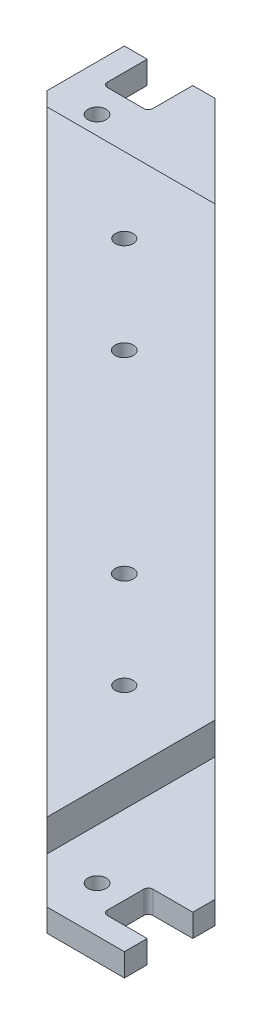
ISO-10303-21;
HEADER;
FILE_DESCRIPTION(('STEP AP214'),'2;1');
FILE_NAME('part.step','',(''),(''),'','','');
FILE_SCHEMA(('AUTOMOTIVE_DESIGN { 1 0 10303 214 1 1 1 1 }'));
ENDSEC;
DATA;
#1=APPLICATION_CONTEXT('core data for automotive mechanical design processes');
#2=APPLICATION_PROTOCOL_DEFINITION('international standard','automotive_design',2000,#1);
#3=PRODUCT_CONTEXT('',#1,'mechanical');
#4=PRODUCT('Part','Part','',(#3));
#5=PRODUCT_RELATED_PRODUCT_CATEGORY('part','',(#4));
#6=PRODUCT_DEFINITION_FORMATION('','',#4);
#7=PRODUCT_DEFINITION_CONTEXT('part definition',#1,'design');
#8=PRODUCT_DEFINITION('design','',#6,#7);
#9=PRODUCT_DEFINITION_SHAPE('','',#8);
#10=(LENGTH_UNIT() NAMED_UNIT(*) SI_UNIT(.MILLI.,.METRE.));
#11=(NAMED_UNIT(*) PLANE_ANGLE_UNIT() SI_UNIT($,.RADIAN.));
#12=(NAMED_UNIT(*) SI_UNIT($,.STERADIAN.) SOLID_ANGLE_UNIT());
#13=UNCERTAINTY_MEASURE_WITH_UNIT(LENGTH_MEASURE(1.E-05),#10,'distance_accuracy_value','');
#14=(GEOMETRIC_REPRESENTATION_CONTEXT(3) GLOBAL_UNCERTAINTY_ASSIGNED_CONTEXT((#13)) GLOBAL_UNIT_ASSIGNED_CONTEXT((#10,
#11,#12)) REPRESENTATION_CONTEXT('',''));
#15=CARTESIAN_POINT('',(0.,0.,0.));
#16=DIRECTION('',(0.,0.,1.));
#17=DIRECTION('',(1.,0.,0.));
#18=AXIS2_PLACEMENT_3D('',#15,#16,#17);
#19=CARTESIAN_POINT('',(19.8964466094067,-311.11709450595,0.25));
#20=DIRECTION('',(0.,0.,-1.));
#21=DIRECTION('',(-1.,0.,0.));
#22=AXIS2_PLACEMENT_3D('',#19,#20,#21);
#23=PLANE('',#22);
#24=DIRECTION('',(0.,1.,0.));
#25=VECTOR('',#24,1.);
#26=CARTESIAN_POINT('',(5.,0.,0.25));
#27=LINE('',#26,#25);
#28=CARTESIAN_POINT('',(5.,0.,0.25));
#29=VERTEX_POINT('',#28);
#30=CARTESIAN_POINT('',(5.,5.,0.25));
#31=VERTEX_POINT('',#30);
#32=EDGE_CURVE('E201',#29,#31,#27,.T.);
#33=ORIENTED_EDGE('',*,*,#32,.F.);
#34=DIRECTION('',(-1.,0.,0.));
#35=VECTOR('',#34,1.);
#36=CARTESIAN_POINT('',(0.,0.,0.25));
#37=LINE('',#36,#35);
#38=CARTESIAN_POINT('',(0.,0.,0.25));
#39=VERTEX_POINT('',#38);
#40=EDGE_CURVE('E208',#29,#39,#37,.T.);
#41=ORIENTED_EDGE('',*,*,#40,.T.);
#42=DIRECTION('',(0.,1.,0.));
#43=VECTOR('',#42,1.);
#44=CARTESIAN_POINT('',(0.,-311.11709450595,0.25));
#45=LINE('',#44,#43);
#46=CARTESIAN_POINT('',(0.,5.,0.25));
#47=VERTEX_POINT('',#46);
#48=EDGE_CURVE('E470',#39,#47,#45,.T.);
#49=ORIENTED_EDGE('',*,*,#48,.T.);
#50=DIRECTION('',(-1.,0.,0.));
#51=VECTOR('',#50,1.);
#52=CARTESIAN_POINT('',(0.,5.,0.25));
#53=LINE('',#52,#51);
#54=EDGE_CURVE('E297',#31,#47,#53,.T.);
#55=ORIENTED_EDGE('',*,*,#54,.F.);
#56=EDGE_LOOP('',(#33,#41,#49,#55));
#57=FACE_BOUND('',#56,.T.);
#58=ADVANCED_FACE('F37',(#57),#23,.T.);
#59=CARTESIAN_POINT('',(172.,-311.11709450595,172.249999999999));
#60=DIRECTION('',(1.,0.,0.));
#61=DIRECTION('',(0.,0.,-1.));
#62=AXIS2_PLACEMENT_3D('',#59,#60,#61);
#63=PLANE('',#62);
#64=DIRECTION('',(0.,1.,0.));
#65=VECTOR('',#64,1.);
#66=CARTESIAN_POINT('',(172.,0.,167.249999999999));
#67=LINE('',#66,#65);
#68=CARTESIAN_POINT('',(172.,0.,167.249999999999));
#69=VERTEX_POINT('',#68);
#70=CARTESIAN_POINT('',(172.,5.,167.249999999999));
#71=VERTEX_POINT('',#70);
#72=EDGE_CURVE('E466',#69,#71,#67,.T.);
#73=ORIENTED_EDGE('',*,*,#72,.T.);
#74=DIRECTION('',(0.,0.,-1.));
#75=VECTOR('',#74,1.);
#76=CARTESIAN_POINT('',(172.,5.,0.));
#77=LINE('',#76,#75);
#78=CARTESIAN_POINT('',(172.,5.,172.249999999999));
#79=VERTEX_POINT('',#78);
#80=EDGE_CURVE('E294',#79,#71,#77,.T.);
#81=ORIENTED_EDGE('',*,*,#80,.F.);
#82=DIRECTION('',(0.,1.,0.));
#83=VECTOR('',#82,1.);
#84=CARTESIAN_POINT('',(172.,-311.11709450595,172.249999999999));
#85=LINE('',#84,#83);
#86=CARTESIAN_POINT('',(172.,0.,172.249999999999));
#87=VERTEX_POINT('',#86);
#88=EDGE_CURVE('E477',#87,#79,#85,.T.);
#89=ORIENTED_EDGE('',*,*,#88,.F.);
#90=DIRECTION('',(0.,0.,-1.));
#91=VECTOR('',#90,1.);
#92=CARTESIAN_POINT('',(172.,0.,0.));
#93=LINE('',#92,#91);
#94=EDGE_CURVE('E213',#87,#69,#93,.T.);
#95=ORIENTED_EDGE('',*,*,#94,.T.);
#96=EDGE_LOOP('',(#73,#81,#89,#95));
#97=FACE_BOUND('',#96,.T.);
#98=ADVANCED_FACE('F351',(#97),#63,.T.);
#99=CARTESIAN_POINT('',(0.,12.,0.));
#100=DIRECTION('',(1.,0.,0.));
#101=DIRECTION('',(0.,0.,-1.));
#102=AXIS2_PLACEMENT_3D('',#99,#100,#101);
#103=PLANE('',#102);
#104=ORIENTED_EDGE('',*,*,#48,.F.);
#105=DIRECTION('',(0.,0.,1.));
#106=VECTOR('',#105,1.);
#107=CARTESIAN_POINT('',(0.,0.,0.));
#108=LINE('',#107,#106);
#109=CARTESIAN_POINT('',(0.,0.,17.25));
#110=VERTEX_POINT('',#109);
#111=EDGE_CURVE('E258',#39,#110,#108,.T.);
#112=ORIENTED_EDGE('',*,*,#111,.T.);
#113=DIRECTION('',(0.,-1.,0.));
#114=VECTOR('',#113,1.);
#115=CARTESIAN_POINT('',(0.,12.,17.25));
#116=LINE('',#115,#114);
#117=CARTESIAN_POINT('',(0.,5.,17.25));
#118=VERTEX_POINT('',#117);
#119=EDGE_CURVE('E273',#118,#110,#116,.T.);
#120=ORIENTED_EDGE('',*,*,#119,.F.);
#121=DIRECTION('',(0.,0.,1.));
#122=VECTOR('',#121,1.);
#123=CARTESIAN_POINT('',(0.,5.,0.));
#124=LINE('',#123,#122);
#125=EDGE_CURVE('E226',#47,#118,#124,.T.);
#126=ORIENTED_EDGE('',*,*,#125,.F.);
#127=EDGE_LOOP('',(#104,#112,#120,#126));
#128=FACE_BOUND('',#127,.T.);
#129=ADVANCED_FACE('F358',(#128),#103,.F.);
#130=CARTESIAN_POINT('',(0.,12.,0.));
#131=DIRECTION('',(0.,1.,0.));
#132=DIRECTION('',(0.,0.,1.));
#133=AXIS2_PLACEMENT_3D('',#130,#131,#132);
#134=PLANE('',#133);
#135=CARTESIAN_POINT('',(128.411688245431,12.,128.691125496954));
#136=DIRECTION('',(0.,1.,0.));
#137=DIRECTION('',(0.,0.,1.));
#138=AXIS2_PLACEMENT_3D('',#135,#136,#137);
#139=CIRCLE('',#138,1.94999999999994);
#140=CARTESIAN_POINT('',(128.411688245431,12.,130.641125496954));
#141=VERTEX_POINT('',#140);
#142=EDGE_CURVE('E217',#141,#141,#139,.T.);
#143=ORIENTED_EDGE('',*,*,#142,.F.);
#144=EDGE_LOOP('',(#143));
#145=FACE_BOUND('',#144,.T.);
#146=CARTESIAN_POINT('',(64.7720779386421,12.,65.0515151901649));
#147=DIRECTION('',(0.,1.,0.));
#148=DIRECTION('',(0.,0.,-1.));
#149=AXIS2_PLACEMENT_3D('',#146,#147,#148);
#150=CIRCLE('',#149,2.);
#151=CARTESIAN_POINT('',(64.7720779386421,12.,63.0515151901649));
#152=VERTEX_POINT('',#151);
#153=EDGE_CURVE('E207',#152,#152,#150,.T.);
#154=ORIENTED_EDGE('',*,*,#153,.F.);
#155=EDGE_LOOP('',(#154));
#156=FACE_BOUND('',#155,.T.);
#157=CARTESIAN_POINT('',(43.5588745030457,12.,43.8383117545685));
#158=DIRECTION('',(0.,1.,0.));
#159=DIRECTION('',(0.,0.,-1.));
#160=AXIS2_PLACEMENT_3D('',#157,#158,#159);
#161=CIRCLE('',#160,1.94999999999992);
#162=CARTESIAN_POINT('',(43.5588745030457,12.,41.8883117545686));
#163=VERTEX_POINT('',#162);
#164=EDGE_CURVE('E211',#163,#163,#161,.T.);
#165=ORIENTED_EDGE('',*,*,#164,.F.);
#166=EDGE_LOOP('',(#165));
#167=FACE_BOUND('',#166,.T.);
#168=CARTESIAN_POINT('',(107.198484809835,12.,107.477922061358));
#169=DIRECTION('',(0.,1.,0.));
#170=DIRECTION('',(0.,0.,1.));
#171=AXIS2_PLACEMENT_3D('',#168,#169,#170);
#172=CIRCLE('',#171,2.);
#173=CARTESIAN_POINT('',(107.198484809835,12.,109.477922061358));
#174=VERTEX_POINT('',#173);
#175=EDGE_CURVE('E220',#174,#174,#172,.T.);
#176=ORIENTED_EDGE('',*,*,#175,.F.);
#177=EDGE_LOOP('',(#176));
#178=FACE_BOUND('',#177,.T.);
#179=DIRECTION('',(0.,0.,1.));
#180=VECTOR('',#179,1.);
#181=CARTESIAN_POINT('',(144.95,12.,172.249999999999));
#182=LINE('',#181,#180);
#183=CARTESIAN_POINT('',(144.95,12.,125.303553390593));
#184=VERTEX_POINT('',#183);
#185=CARTESIAN_POINT('',(144.95,12.,162.199999999999));
#186=VERTEX_POINT('',#185);
#187=EDGE_CURVE('E238',#184,#186,#182,.T.);
#188=ORIENTED_EDGE('',*,*,#187,.F.);
#189=DIRECTION('',(-0.707106781186549,0.,-0.707106781186546));
#190=VECTOR('',#189,1.);
#191=CARTESIAN_POINT('',(9.82322330470332,12.,-9.82322330470336));
#192=LINE('',#191,#190);
#193=CARTESIAN_POINT('',(46.9464466094068,12.,27.3));
#194=VERTEX_POINT('',#193);
#195=EDGE_CURVE('E482',#184,#194,#192,.T.);
#196=ORIENTED_EDGE('',*,*,#195,.T.);
#197=DIRECTION('',(1.,0.,0.));
#198=VECTOR('',#197,1.);
#199=CARTESIAN_POINT('',(0.,12.,27.3));
#200=LINE('',#199,#198);
#201=CARTESIAN_POINT('',(10.05,12.,27.3));
#202=VERTEX_POINT('',#201);
#203=EDGE_CURVE('E229',#202,#194,#200,.T.);
#204=ORIENTED_EDGE('',*,*,#203,.F.);
#205=DIRECTION('',(0.707106781186549,0.,0.707106781186546));
#206=VECTOR('',#205,1.);
#207=CARTESIAN_POINT('',(0.,12.,17.25));
#208=LINE('',#207,#206);
#209=EDGE_CURVE('E261',#202,#186,#208,.T.);
#210=ORIENTED_EDGE('',*,*,#209,.T.);
#211=EDGE_LOOP('',(#188,#196,#204,#210));
#212=FACE_BOUND('',#211,.T.);
#213=ADVANCED_FACE('F416',(#145,#156,#167,#178,#212),#134,.T.);
#214=CARTESIAN_POINT('',(0.,0.,0.));
#215=DIRECTION('',(0.,1.,0.));
#216=DIRECTION('',(0.,0.,1.));
#217=AXIS2_PLACEMENT_3D('',#214,#215,#216);
#218=PLANE('',#217);
#219=ORIENTED_EDGE('',*,*,#40,.F.);
#220=DIRECTION('',(0.,0.,1.));
#221=VECTOR('',#220,1.);
#222=CARTESIAN_POINT('',(5.,0.,0.25));
#223=LINE('',#222,#221);
#224=CARTESIAN_POINT('',(5.,0.,9.));
#225=VERTEX_POINT('',#224);
#226=EDGE_CURVE('E515',#29,#225,#223,.T.);
#227=ORIENTED_EDGE('',*,*,#226,.T.);
#228=CARTESIAN_POINT('',(6.,0.,9.));
#229=DIRECTION('',(0.,1.,0.));
#230=DIRECTION('',(0.,0.,1.));
#231=AXIS2_PLACEMENT_3D('',#228,#229,#230);
#232=CIRCLE('',#231,1.);
#233=CARTESIAN_POINT('',(6.,0.,10.));
#234=VERTEX_POINT('',#233);
#235=EDGE_CURVE('E329',#225,#234,#232,.T.);
#236=ORIENTED_EDGE('',*,*,#235,.T.);
#237=DIRECTION('',(1.,0.,0.));
#238=VECTOR('',#237,1.);
#239=CARTESIAN_POINT('',(5.,0.,10.));
#240=LINE('',#239,#238);
#241=CARTESIAN_POINT('',(14.,0.,10.));
#242=VERTEX_POINT('',#241);
#243=EDGE_CURVE('E193',#234,#242,#240,.T.);
#244=ORIENTED_EDGE('',*,*,#243,.T.);
#245=CARTESIAN_POINT('',(14.,0.,9.));
#246=DIRECTION('',(0.,1.,0.));
#247=DIRECTION('',(0.,0.,1.));
#248=AXIS2_PLACEMENT_3D('',#245,#246,#247);
#249=CIRCLE('',#248,1.);
#250=CARTESIAN_POINT('',(15.,0.,9.));
#251=VERTEX_POINT('',#250);
#252=EDGE_CURVE('E11',#242,#251,#249,.T.);
#253=ORIENTED_EDGE('',*,*,#252,.T.);
#254=DIRECTION('',(0.,0.,-1.));
#255=VECTOR('',#254,1.);
#256=CARTESIAN_POINT('',(15.,0.,0.25));
#257=LINE('',#256,#255);
#258=CARTESIAN_POINT('',(15.,0.,0.25));
#259=VERTEX_POINT('',#258);
#260=EDGE_CURVE('E183',#251,#259,#257,.T.);
#261=ORIENTED_EDGE('',*,*,#260,.T.);
#262=CARTESIAN_POINT('',(19.8964466094067,0.,0.25));
#263=VERTEX_POINT('',#262);
#264=EDGE_CURVE('E190',#263,#259,#37,.T.);
#265=ORIENTED_EDGE('',*,*,#264,.F.);
#266=DIRECTION('',(-0.707106781186549,0.,-0.707106781186546));
#267=VECTOR('',#266,1.);
#268=CARTESIAN_POINT('',(9.82322330470332,0.,-9.82322330470336));
#269=LINE('',#268,#267);
#270=CARTESIAN_POINT('',(172.,0.,152.353553390593));
#271=VERTEX_POINT('',#270);
#272=EDGE_CURVE('E489',#271,#263,#269,.T.);
#273=ORIENTED_EDGE('',*,*,#272,.F.);
#274=CARTESIAN_POINT('',(172.,0.,157.249999999999));
#275=VERTEX_POINT('',#274);
#276=EDGE_CURVE('E490',#275,#271,#93,.T.);
#277=ORIENTED_EDGE('',*,*,#276,.F.);
#278=DIRECTION('',(-1.,0.,0.));
#279=VECTOR('',#278,1.);
#280=CARTESIAN_POINT('',(172.,0.,157.249999999999));
#281=LINE('',#280,#279);
#282=CARTESIAN_POINT('',(163.25,0.,157.249999999999));
#283=VERTEX_POINT('',#282);
#284=EDGE_CURVE('E447',#275,#283,#281,.T.);
#285=ORIENTED_EDGE('',*,*,#284,.T.);
#286=CARTESIAN_POINT('',(163.25,0.,158.249999999999));
#287=DIRECTION('',(0.,1.,0.));
#288=DIRECTION('',(0.,0.,1.));
#289=AXIS2_PLACEMENT_3D('',#286,#287,#288);
#290=CIRCLE('',#289,1.);
#291=CARTESIAN_POINT('',(162.25,0.,158.249999999999));
#292=VERTEX_POINT('',#291);
#293=EDGE_CURVE('E325',#283,#292,#290,.T.);
#294=ORIENTED_EDGE('',*,*,#293,.T.);
#295=DIRECTION('',(0.,0.,1.));
#296=VECTOR('',#295,1.);
#297=CARTESIAN_POINT('',(162.25,0.,167.249999999999));
#298=LINE('',#297,#296);
#299=CARTESIAN_POINT('',(162.25,0.,166.249999999999));
#300=VERTEX_POINT('',#299);
#301=EDGE_CURVE('E444',#292,#300,#298,.T.);
#302=ORIENTED_EDGE('',*,*,#301,.T.);
#303=CARTESIAN_POINT('',(163.25,0.,166.249999999999));
#304=DIRECTION('',(0.,1.,0.));
#305=DIRECTION('',(0.,0.,1.));
#306=AXIS2_PLACEMENT_3D('',#303,#304,#305);
#307=CIRCLE('',#306,1.);
#308=CARTESIAN_POINT('',(163.25,0.,167.249999999999));
#309=VERTEX_POINT('',#308);
#310=EDGE_CURVE('E321',#300,#309,#307,.T.);
#311=ORIENTED_EDGE('',*,*,#310,.T.);
#312=DIRECTION('',(1.,0.,0.));
#313=VECTOR('',#312,1.);
#314=CARTESIAN_POINT('',(172.,0.,167.249999999999));
#315=LINE('',#314,#313);
#316=EDGE_CURVE('E453',#309,#69,#315,.T.);
#317=ORIENTED_EDGE('',*,*,#316,.T.);
#318=ORIENTED_EDGE('',*,*,#94,.F.);
#319=DIRECTION('',(1.,0.,0.));
#320=VECTOR('',#319,1.);
#321=CARTESIAN_POINT('',(155.,0.,172.249999999999));
#322=LINE('',#321,#320);
#323=CARTESIAN_POINT('',(155.,0.,172.249999999999));
#324=VERTEX_POINT('',#323);
#325=EDGE_CURVE('E265',#324,#87,#322,.T.);
#326=ORIENTED_EDGE('',*,*,#325,.F.);
#327=DIRECTION('',(0.707106781186549,0.,0.707106781186546));
#328=VECTOR('',#327,1.);
#329=CARTESIAN_POINT('',(0.,0.,17.25));
#330=LINE('',#329,#328);
#331=EDGE_CURVE('E267',#110,#324,#330,.T.);
#332=ORIENTED_EDGE('',*,*,#331,.F.);
#333=ORIENTED_EDGE('',*,*,#111,.F.);
#334=EDGE_LOOP('',(#219,#227,#236,#244,#253,#261,#265,#273,#277,#285,#294,#302,#311,#317,#318,
#326,#332,#333));
#335=FACE_BOUND('',#334,.T.);
#336=CARTESIAN_POINT('',(156.,0.,162.25));
#337=DIRECTION('',(0.,1.,0.));
#338=DIRECTION('',(0.,0.,1.));
#339=AXIS2_PLACEMENT_3D('',#336,#337,#338);
#340=CIRCLE('',#339,2.);
#341=CARTESIAN_POINT('',(156.,0.,164.25));
#342=VERTEX_POINT('',#341);
#343=EDGE_CURVE('E254',#342,#342,#340,.T.);
#344=ORIENTED_EDGE('',*,*,#343,.T.);
#345=EDGE_LOOP('',(#344));
#346=FACE_BOUND('',#345,.T.);
#347=CARTESIAN_POINT('',(10.,0.,16.25));
#348=DIRECTION('',(0.,1.,0.));
#349=DIRECTION('',(0.,0.,1.));
#350=AXIS2_PLACEMENT_3D('',#347,#348,#349);
#351=CIRCLE('',#350,2.);
#352=CARTESIAN_POINT('',(10.,0.,18.25));
#353=VERTEX_POINT('',#352);
#354=EDGE_CURVE('E255',#353,#353,#351,.T.);
#355=ORIENTED_EDGE('',*,*,#354,.T.);
#356=EDGE_LOOP('',(#355));
#357=FACE_BOUND('',#356,.T.);
#358=CARTESIAN_POINT('',(107.198484809835,0.,107.477922061358));
#359=DIRECTION('',(0.,1.,0.));
#360=DIRECTION('',(0.,0.,1.));
#361=AXIS2_PLACEMENT_3D('',#358,#359,#360);
#362=CIRCLE('',#361,2.);
#363=CARTESIAN_POINT('',(107.198484809835,0.,109.477922061358));
#364=VERTEX_POINT('',#363);
#365=EDGE_CURVE('E219',#364,#364,#362,.F.);
#366=ORIENTED_EDGE('',*,*,#365,.F.);
#367=EDGE_LOOP('',(#366));
#368=FACE_BOUND('',#367,.T.);
#369=CARTESIAN_POINT('',(43.5588745030457,0.,43.8383117545685));
#370=DIRECTION('',(0.,1.,0.));
#371=DIRECTION('',(0.,0.,1.));
#372=AXIS2_PLACEMENT_3D('',#369,#370,#371);
#373=CIRCLE('',#372,1.94999999999992);
#374=CARTESIAN_POINT('',(43.5588745030457,0.,45.7883117545684));
#375=VERTEX_POINT('',#374);
#376=EDGE_CURVE('E283',#375,#375,#373,.F.);
#377=ORIENTED_EDGE('',*,*,#376,.F.);
#378=EDGE_LOOP('',(#377));
#379=FACE_BOUND('',#378,.T.);
#380=CARTESIAN_POINT('',(64.7720779386421,0.,65.0515151901649));
#381=DIRECTION('',(0.,1.,0.));
#382=DIRECTION('',(0.,0.,1.));
#383=AXIS2_PLACEMENT_3D('',#380,#381,#382);
#384=CIRCLE('',#383,2.);
#385=CARTESIAN_POINT('',(64.7720779386421,0.,67.0515151901649));
#386=VERTEX_POINT('',#385);
#387=EDGE_CURVE('E286',#386,#386,#384,.F.);
#388=ORIENTED_EDGE('',*,*,#387,.F.);
#389=EDGE_LOOP('',(#388));
#390=FACE_BOUND('',#389,.T.);
#391=CARTESIAN_POINT('',(128.411688245431,0.,128.691125496954));
#392=DIRECTION('',(0.,1.,0.));
#393=DIRECTION('',(0.,0.,1.));
#394=AXIS2_PLACEMENT_3D('',#391,#392,#393);
#395=CIRCLE('',#394,1.94999999999994);
#396=CARTESIAN_POINT('',(128.411688245431,0.,130.641125496954));
#397=VERTEX_POINT('',#396);
#398=EDGE_CURVE('E242',#397,#397,#395,.F.);
#399=ORIENTED_EDGE('',*,*,#398,.F.);
#400=EDGE_LOOP('',(#399));
#401=FACE_BOUND('',#400,.T.);
#402=ADVANCED_FACE('F186',(#335,#346,#357,#368,#379,#390,#401),#218,.F.);
#403=CARTESIAN_POINT('',(0.,5.,27.3));
#404=DIRECTION('',(0.,0.,1.));
#405=DIRECTION('',(1.,0.,0.));
#406=AXIS2_PLACEMENT_3D('',#403,#404,#405);
#407=PLANE('',#406);
#408=DIRECTION('',(0.,1.,0.));
#409=VECTOR('',#408,1.);
#410=CARTESIAN_POINT('',(46.9464466094068,5.,27.3));
#411=LINE('',#410,#409);
#412=CARTESIAN_POINT('',(46.9464466094068,5.,27.3));
#413=VERTEX_POINT('',#412);
#414=EDGE_CURVE('E485',#413,#194,#411,.T.);
#415=ORIENTED_EDGE('',*,*,#414,.F.);
#416=DIRECTION('',(1.,0.,0.));
#417=VECTOR('',#416,1.);
#418=CARTESIAN_POINT('',(0.,5.,27.3));
#419=LINE('',#418,#417);
#420=CARTESIAN_POINT('',(10.05,5.,27.3));
#421=VERTEX_POINT('',#420);
#422=EDGE_CURVE('E228',#421,#413,#419,.T.);
#423=ORIENTED_EDGE('',*,*,#422,.F.);
#424=DIRECTION('',(0.,-1.,0.));
#425=VECTOR('',#424,1.);
#426=CARTESIAN_POINT('',(10.05,12.,27.3));
#427=LINE('',#426,#425);
#428=EDGE_CURVE('E251',#202,#421,#427,.T.);
#429=ORIENTED_EDGE('',*,*,#428,.F.);
#430=ORIENTED_EDGE('',*,*,#203,.T.);
#431=EDGE_LOOP('',(#415,#423,#429,#430));
#432=FACE_BOUND('',#431,.T.);
#433=ADVANCED_FACE('F396',(#432),#407,.F.);
#434=CARTESIAN_POINT('',(0.,5.,0.));
#435=DIRECTION('',(0.,1.,0.));
#436=DIRECTION('',(0.,0.,1.));
#437=AXIS2_PLACEMENT_3D('',#434,#435,#436);
#438=PLANE('',#437);
#439=DIRECTION('',(0.,0.,1.));
#440=VECTOR('',#439,1.);
#441=CARTESIAN_POINT('',(5.,5.,0.25));
#442=LINE('',#441,#440);
#443=CARTESIAN_POINT('',(5.,5.,9.));
#444=VERTEX_POINT('',#443);
#445=EDGE_CURVE('E341',#31,#444,#442,.T.);
#446=ORIENTED_EDGE('',*,*,#445,.F.);
#447=ORIENTED_EDGE('',*,*,#54,.T.);
#448=ORIENTED_EDGE('',*,*,#125,.T.);
#449=DIRECTION('',(0.707106781186549,0.,0.707106781186546));
#450=VECTOR('',#449,1.);
#451=CARTESIAN_POINT('',(0.,5.,17.25));
#452=LINE('',#451,#450);
#453=EDGE_CURVE('E243',#118,#421,#452,.T.);
#454=ORIENTED_EDGE('',*,*,#453,.T.);
#455=ORIENTED_EDGE('',*,*,#422,.T.);
#456=DIRECTION('',(-0.707106781186549,0.,-0.707106781186546));
#457=VECTOR('',#456,1.);
#458=CARTESIAN_POINT('',(9.82322330470332,5.,-9.82322330470336));
#459=LINE('',#458,#457);
#460=CARTESIAN_POINT('',(19.8964466094067,5.,0.25));
#461=VERTEX_POINT('',#460);
#462=EDGE_CURVE('E487',#413,#461,#459,.T.);
#463=ORIENTED_EDGE('',*,*,#462,.T.);
#464=CARTESIAN_POINT('',(15.,5.,0.25));
#465=VERTEX_POINT('',#464);
#466=EDGE_CURVE('E298',#461,#465,#53,.T.);
#467=ORIENTED_EDGE('',*,*,#466,.T.);
#468=DIRECTION('',(0.,0.,-1.));
#469=VECTOR('',#468,1.);
#470=CARTESIAN_POINT('',(15.,5.,0.25));
#471=LINE('',#470,#469);
#472=CARTESIAN_POINT('',(15.,5.,9.));
#473=VERTEX_POINT('',#472);
#474=EDGE_CURVE('E198',#473,#465,#471,.T.);
#475=ORIENTED_EDGE('',*,*,#474,.F.);
#476=CARTESIAN_POINT('',(14.,5.,9.));
#477=DIRECTION('',(0.,1.,0.));
#478=DIRECTION('',(0.,0.,1.));
#479=AXIS2_PLACEMENT_3D('',#476,#477,#478);
#480=CIRCLE('',#479,1.);
#481=CARTESIAN_POINT('',(14.,5.,10.));
#482=VERTEX_POINT('',#481);
#483=EDGE_CURVE('E45',#473,#482,#480,.F.);
#484=ORIENTED_EDGE('',*,*,#483,.T.);
#485=DIRECTION('',(1.,0.,0.));
#486=VECTOR('',#485,1.);
#487=CARTESIAN_POINT('',(5.,5.,10.));
#488=LINE('',#487,#486);
#489=CARTESIAN_POINT('',(6.,5.,10.));
#490=VERTEX_POINT('',#489);
#491=EDGE_CURVE('E336',#490,#482,#488,.T.);
#492=ORIENTED_EDGE('',*,*,#491,.F.);
#493=CARTESIAN_POINT('',(6.,5.,9.));
#494=DIRECTION('',(0.,1.,0.));
#495=DIRECTION('',(0.,0.,1.));
#496=AXIS2_PLACEMENT_3D('',#493,#494,#495);
#497=CIRCLE('',#496,1.);
#498=EDGE_CURVE('E327',#490,#444,#497,.F.);
#499=ORIENTED_EDGE('',*,*,#498,.T.);
#500=EDGE_LOOP('',(#446,#447,#448,#454,#455,#463,#467,#475,#484,#492,#499));
#501=FACE_BOUND('',#500,.T.);
#502=CARTESIAN_POINT('',(10.,5.,16.25));
#503=DIRECTION('',(0.,1.,0.));
#504=DIRECTION('',(0.,0.,1.));
#505=AXIS2_PLACEMENT_3D('',#502,#503,#504);
#506=CIRCLE('',#505,2.);
#507=CARTESIAN_POINT('',(10.,5.,18.25));
#508=VERTEX_POINT('',#507);
#509=EDGE_CURVE('E232',#508,#508,#506,.F.);
#510=ORIENTED_EDGE('',*,*,#509,.T.);
#511=EDGE_LOOP('',(#510));
#512=FACE_BOUND('',#511,.T.);
#513=ADVANCED_FACE('F334',(#501,#512),#438,.T.);
#514=CARTESIAN_POINT('',(144.95,5.,172.249999999999));
#515=DIRECTION('',(-1.,0.,0.));
#516=DIRECTION('',(0.,0.,1.));
#517=AXIS2_PLACEMENT_3D('',#514,#515,#516);
#518=PLANE('',#517);
#519=DIRECTION('',(0.,-1.,0.));
#520=VECTOR('',#519,1.);
#521=CARTESIAN_POINT('',(144.95,5.,125.303553390593));
#522=LINE('',#521,#520);
#523=CARTESIAN_POINT('',(144.95,5.,125.303553390593));
#524=VERTEX_POINT('',#523);
#525=EDGE_CURVE('E480',#184,#524,#522,.T.);
#526=ORIENTED_EDGE('',*,*,#525,.F.);
#527=ORIENTED_EDGE('',*,*,#187,.T.);
#528=DIRECTION('',(0.,1.,0.));
#529=VECTOR('',#528,1.);
#530=CARTESIAN_POINT('',(144.95,12.,162.199999999999));
#531=LINE('',#530,#529);
#532=CARTESIAN_POINT('',(144.95,5.,162.199999999999));
#533=VERTEX_POINT('',#532);
#534=EDGE_CURVE('E248',#533,#186,#531,.T.);
#535=ORIENTED_EDGE('',*,*,#534,.F.);
#536=DIRECTION('',(0.,0.,1.));
#537=VECTOR('',#536,1.);
#538=CARTESIAN_POINT('',(144.95,5.,172.249999999999));
#539=LINE('',#538,#537);
#540=EDGE_CURVE('E236',#524,#533,#539,.T.);
#541=ORIENTED_EDGE('',*,*,#540,.F.);
#542=EDGE_LOOP('',(#526,#527,#535,#541));
#543=FACE_BOUND('',#542,.T.);
#544=ADVANCED_FACE('F395',(#543),#518,.F.);
#545=CARTESIAN_POINT('',(0.,5.,0.));
#546=DIRECTION('',(0.,1.,0.));
#547=DIRECTION('',(0.,0.,1.));
#548=AXIS2_PLACEMENT_3D('',#545,#546,#547);
#549=PLANE('',#548);
#550=DIRECTION('',(1.,0.,0.));
#551=VECTOR('',#550,1.);
#552=CARTESIAN_POINT('',(172.,5.,167.249999999999));
#553=LINE('',#552,#551);
#554=CARTESIAN_POINT('',(163.25,5.,167.249999999999));
#555=VERTEX_POINT('',#554);
#556=EDGE_CURVE('E457',#555,#71,#553,.T.);
#557=ORIENTED_EDGE('',*,*,#556,.F.);
#558=CARTESIAN_POINT('',(163.25,5.,166.249999999999));
#559=DIRECTION('',(0.,1.,0.));
#560=DIRECTION('',(0.,0.,1.));
#561=AXIS2_PLACEMENT_3D('',#558,#559,#560);
#562=CIRCLE('',#561,1.);
#563=CARTESIAN_POINT('',(162.25,5.,166.249999999999));
#564=VERTEX_POINT('',#563);
#565=EDGE_CURVE('E319',#555,#564,#562,.F.);
#566=ORIENTED_EDGE('',*,*,#565,.T.);
#567=DIRECTION('',(0.,0.,1.));
#568=VECTOR('',#567,1.);
#569=CARTESIAN_POINT('',(162.25,5.,167.249999999999));
#570=LINE('',#569,#568);
#571=CARTESIAN_POINT('',(162.25,5.,158.249999999999));
#572=VERTEX_POINT('',#571);
#573=EDGE_CURVE('E463',#572,#564,#570,.T.);
#574=ORIENTED_EDGE('',*,*,#573,.F.);
#575=CARTESIAN_POINT('',(163.25,5.,158.249999999999));
#576=DIRECTION('',(0.,1.,0.));
#577=DIRECTION('',(0.,0.,1.));
#578=AXIS2_PLACEMENT_3D('',#575,#576,#577);
#579=CIRCLE('',#578,1.);
#580=CARTESIAN_POINT('',(163.25,5.,157.249999999999));
#581=VERTEX_POINT('',#580);
#582=EDGE_CURVE('E323',#572,#581,#579,.F.);
#583=ORIENTED_EDGE('',*,*,#582,.T.);
#584=DIRECTION('',(-1.,0.,0.));
#585=VECTOR('',#584,1.);
#586=CARTESIAN_POINT('',(172.,5.,157.249999999999));
#587=LINE('',#586,#585);
#588=CARTESIAN_POINT('',(172.,5.,157.249999999999));
#589=VERTEX_POINT('',#588);
#590=EDGE_CURVE('E460',#589,#581,#587,.T.);
#591=ORIENTED_EDGE('',*,*,#590,.F.);
#592=CARTESIAN_POINT('',(172.,5.,152.353553390593));
#593=VERTEX_POINT('',#592);
#594=EDGE_CURVE('E293',#589,#593,#77,.T.);
#595=ORIENTED_EDGE('',*,*,#594,.T.);
#596=DIRECTION('',(-0.707106781186549,0.,-0.707106781186546));
#597=VECTOR('',#596,1.);
#598=CARTESIAN_POINT('',(9.82322330470332,5.,-9.82322330470336));
#599=LINE('',#598,#597);
#600=EDGE_CURVE('E276',#593,#524,#599,.T.);
#601=ORIENTED_EDGE('',*,*,#600,.T.);
#602=ORIENTED_EDGE('',*,*,#540,.T.);
#603=DIRECTION('',(0.707106781186549,0.,0.707106781186546));
#604=VECTOR('',#603,1.);
#605=CARTESIAN_POINT('',(0.,5.,17.25));
#606=LINE('',#605,#604);
#607=CARTESIAN_POINT('',(155.,5.,172.249999999999));
#608=VERTEX_POINT('',#607);
#609=EDGE_CURVE('E246',#533,#608,#606,.T.);
#610=ORIENTED_EDGE('',*,*,#609,.T.);
#611=DIRECTION('',(1.,0.,0.));
#612=VECTOR('',#611,1.);
#613=CARTESIAN_POINT('',(172.25,5.,172.249999999999));
#614=LINE('',#613,#612);
#615=EDGE_CURVE('E235',#608,#79,#614,.T.);
#616=ORIENTED_EDGE('',*,*,#615,.T.);
#617=ORIENTED_EDGE('',*,*,#80,.T.);
#618=EDGE_LOOP('',(#557,#566,#574,#583,#591,#595,#601,#602,#610,#616,#617));
#619=FACE_BOUND('',#618,.T.);
#620=CARTESIAN_POINT('',(156.,5.,162.25));
#621=DIRECTION('',(0.,1.,0.));
#622=DIRECTION('',(0.,0.,1.));
#623=AXIS2_PLACEMENT_3D('',#620,#621,#622);
#624=CIRCLE('',#623,2.);
#625=CARTESIAN_POINT('',(156.,5.,164.25));
#626=VERTEX_POINT('',#625);
#627=EDGE_CURVE('E245',#626,#626,#624,.F.);
#628=ORIENTED_EDGE('',*,*,#627,.T.);
#629=EDGE_LOOP('',(#628));
#630=FACE_BOUND('',#629,.T.);
#631=ADVANCED_FACE('F400',(#619,#630),#549,.T.);
#632=CARTESIAN_POINT('',(155.,12.,172.249999999999));
#633=DIRECTION('',(0.,0.,-1.));
#634=DIRECTION('',(-1.,0.,0.));
#635=AXIS2_PLACEMENT_3D('',#632,#633,#634);
#636=PLANE('',#635);
#637=ORIENTED_EDGE('',*,*,#325,.T.);
#638=ORIENTED_EDGE('',*,*,#88,.T.);
#639=ORIENTED_EDGE('',*,*,#615,.F.);
#640=DIRECTION('',(0.,-1.,0.));
#641=VECTOR('',#640,1.);
#642=CARTESIAN_POINT('',(155.,12.,172.249999999999));
#643=LINE('',#642,#641);
#644=EDGE_CURVE('E264',#608,#324,#643,.T.);
#645=ORIENTED_EDGE('',*,*,#644,.T.);
#646=EDGE_LOOP('',(#637,#638,#639,#645));
#647=FACE_BOUND('',#646,.T.);
#648=ADVANCED_FACE('F403',(#647),#636,.F.);
#649=CARTESIAN_POINT('',(156.,0.,162.25));
#650=DIRECTION('',(0.,1.,0.));
#651=DIRECTION('',(0.,0.,1.));
#652=AXIS2_PLACEMENT_3D('',#649,#650,#651);
#653=CYLINDRICAL_SURFACE('',#652,2.);
#654=ORIENTED_EDGE('',*,*,#343,.F.);
#655=EDGE_LOOP('',(#654));
#656=FACE_BOUND('',#655,.T.);
#657=ORIENTED_EDGE('',*,*,#627,.F.);
#658=EDGE_LOOP('',(#657));
#659=FACE_BOUND('',#658,.T.);
#660=ADVANCED_FACE('F411',(#656,#659),#653,.F.);
#661=CARTESIAN_POINT('',(10.,0.,16.25));
#662=DIRECTION('',(0.,1.,0.));
#663=DIRECTION('',(0.,0.,1.));
#664=AXIS2_PLACEMENT_3D('',#661,#662,#663);
#665=CYLINDRICAL_SURFACE('',#664,2.);
#666=ORIENTED_EDGE('',*,*,#354,.F.);
#667=EDGE_LOOP('',(#666));
#668=FACE_BOUND('',#667,.T.);
#669=ORIENTED_EDGE('',*,*,#509,.F.);
#670=EDGE_LOOP('',(#669));
#671=FACE_BOUND('',#670,.T.);
#672=ADVANCED_FACE('F408',(#668,#671),#665,.F.);
#673=CARTESIAN_POINT('',(0.,12.,17.25));
#674=DIRECTION('',(0.707106781186546,0.,-0.707106781186549));
#675=DIRECTION('',(-0.707106781186549,0.,-0.707106781186546));
#676=AXIS2_PLACEMENT_3D('',#673,#674,#675);
#677=PLANE('',#676);
#678=ORIENTED_EDGE('',*,*,#209,.F.);
#679=ORIENTED_EDGE('',*,*,#428,.T.);
#680=ORIENTED_EDGE('',*,*,#453,.F.);
#681=ORIENTED_EDGE('',*,*,#119,.T.);
#682=ORIENTED_EDGE('',*,*,#331,.T.);
#683=ORIENTED_EDGE('',*,*,#644,.F.);
#684=ORIENTED_EDGE('',*,*,#609,.F.);
#685=ORIENTED_EDGE('',*,*,#534,.T.);
#686=EDGE_LOOP('',(#678,#679,#680,#681,#682,#683,#684,#685));
#687=FACE_BOUND('',#686,.T.);
#688=ADVANCED_FACE('F388',(#687),#677,.F.);
#689=CARTESIAN_POINT('',(107.198484809835,12.,107.477922061358));
#690=DIRECTION('',(0.,-1.,0.));
#691=DIRECTION('',(0.,0.,-1.));
#692=AXIS2_PLACEMENT_3D('',#689,#690,#691);
#693=CYLINDRICAL_SURFACE('',#692,2.);
#694=ORIENTED_EDGE('',*,*,#175,.T.);
#695=EDGE_LOOP('',(#694));
#696=FACE_BOUND('',#695,.T.);
#697=ORIENTED_EDGE('',*,*,#365,.T.);
#698=EDGE_LOOP('',(#697));
#699=FACE_BOUND('',#698,.T.);
#700=ADVANCED_FACE('F385',(#696,#699),#693,.F.);
#701=CARTESIAN_POINT('',(43.5588745030457,12.,43.8383117545685));
#702=DIRECTION('',(0.,-1.,0.));
#703=DIRECTION('',(0.,0.,-1.));
#704=AXIS2_PLACEMENT_3D('',#701,#702,#703);
#705=CYLINDRICAL_SURFACE('',#704,1.94999999999992);
#706=ORIENTED_EDGE('',*,*,#164,.T.);
#707=EDGE_LOOP('',(#706));
#708=FACE_BOUND('',#707,.T.);
#709=ORIENTED_EDGE('',*,*,#376,.T.);
#710=EDGE_LOOP('',(#709));
#711=FACE_BOUND('',#710,.T.);
#712=ADVANCED_FACE('F380',(#708,#711),#705,.F.);
#713=CARTESIAN_POINT('',(64.7720779386421,12.,65.0515151901649));
#714=DIRECTION('',(0.,-1.,0.));
#715=DIRECTION('',(0.,0.,-1.));
#716=AXIS2_PLACEMENT_3D('',#713,#714,#715);
#717=CYLINDRICAL_SURFACE('',#716,2.);
#718=ORIENTED_EDGE('',*,*,#153,.T.);
#719=EDGE_LOOP('',(#718));
#720=FACE_BOUND('',#719,.T.);
#721=ORIENTED_EDGE('',*,*,#387,.T.);
#722=EDGE_LOOP('',(#721));
#723=FACE_BOUND('',#722,.T.);
#724=ADVANCED_FACE('F373',(#720,#723),#717,.F.);
#725=CARTESIAN_POINT('',(128.411688245431,12.,128.691125496954));
#726=DIRECTION('',(0.,-1.,0.));
#727=DIRECTION('',(0.,0.,-1.));
#728=AXIS2_PLACEMENT_3D('',#725,#726,#727);
#729=CYLINDRICAL_SURFACE('',#728,1.94999999999994);
#730=ORIENTED_EDGE('',*,*,#142,.T.);
#731=EDGE_LOOP('',(#730));
#732=FACE_BOUND('',#731,.T.);
#733=ORIENTED_EDGE('',*,*,#398,.T.);
#734=EDGE_LOOP('',(#733));
#735=FACE_BOUND('',#734,.T.);
#736=ADVANCED_FACE('F366',(#732,#735),#729,.F.);
#737=DIRECTION('',(0.,1.,0.));
#738=VECTOR('',#737,1.);
#739=CARTESIAN_POINT('',(15.,0.,0.25));
#740=LINE('',#739,#738);
#741=EDGE_CURVE('E192',#259,#465,#740,.T.);
#742=ORIENTED_EDGE('',*,*,#741,.T.);
#743=ORIENTED_EDGE('',*,*,#466,.F.);
#744=DIRECTION('',(0.,1.,0.));
#745=VECTOR('',#744,1.);
#746=CARTESIAN_POINT('',(19.8964466094067,-311.11709450595,0.25));
#747=LINE('',#746,#745);
#748=EDGE_CURVE('E206',#263,#461,#747,.T.);
#749=ORIENTED_EDGE('',*,*,#748,.F.);
#750=ORIENTED_EDGE('',*,*,#264,.T.);
#751=EDGE_LOOP('',(#742,#743,#749,#750));
#752=FACE_BOUND('',#751,.T.);
#753=ADVANCED_FACE('F204',(#752),#23,.T.);
#754=DIRECTION('',(0.,1.,0.));
#755=VECTOR('',#754,1.);
#756=CARTESIAN_POINT('',(172.,0.,157.249999999999));
#757=LINE('',#756,#755);
#758=EDGE_CURVE('E455',#275,#589,#757,.T.);
#759=ORIENTED_EDGE('',*,*,#758,.F.);
#760=ORIENTED_EDGE('',*,*,#276,.T.);
#761=DIRECTION('',(0.,1.,0.));
#762=VECTOR('',#761,1.);
#763=CARTESIAN_POINT('',(172.,-311.11709450595,152.353553390593));
#764=LINE('',#763,#762);
#765=EDGE_CURVE('E473',#271,#593,#764,.T.);
#766=ORIENTED_EDGE('',*,*,#765,.T.);
#767=ORIENTED_EDGE('',*,*,#594,.F.);
#768=EDGE_LOOP('',(#759,#760,#766,#767));
#769=FACE_BOUND('',#768,.T.);
#770=ADVANCED_FACE('F361',(#769),#63,.T.);
#771=CARTESIAN_POINT('',(172.,-311.11709450595,152.353553390593));
#772=DIRECTION('',(0.707106781186546,0.,-0.707106781186549));
#773=DIRECTION('',(-0.707106781186549,0.,-0.707106781186546));
#774=AXIS2_PLACEMENT_3D('',#771,#772,#773);
#775=PLANE('',#774);
#776=ORIENTED_EDGE('',*,*,#765,.F.);
#777=ORIENTED_EDGE('',*,*,#272,.T.);
#778=ORIENTED_EDGE('',*,*,#748,.T.);
#779=ORIENTED_EDGE('',*,*,#462,.F.);
#780=ORIENTED_EDGE('',*,*,#414,.T.);
#781=ORIENTED_EDGE('',*,*,#195,.F.);
#782=ORIENTED_EDGE('',*,*,#525,.T.);
#783=ORIENTED_EDGE('',*,*,#600,.F.);
#784=EDGE_LOOP('',(#776,#777,#778,#779,#780,#781,#782,#783));
#785=FACE_BOUND('',#784,.T.);
#786=ADVANCED_FACE('F370',(#785),#775,.T.);
#787=CARTESIAN_POINT('',(172.,0.,167.249999999999));
#788=DIRECTION('',(0.,0.,1.));
#789=DIRECTION('',(1.,0.,0.));
#790=AXIS2_PLACEMENT_3D('',#787,#788,#789);
#791=PLANE('',#790);
#792=ORIENTED_EDGE('',*,*,#316,.F.);
#793=DIRECTION('',(0.,1.,0.));
#794=VECTOR('',#793,1.);
#795=CARTESIAN_POINT('',(163.25,5.,167.249999999999));
#796=LINE('',#795,#794);
#797=EDGE_CURVE('E300',#309,#555,#796,.T.);
#798=ORIENTED_EDGE('',*,*,#797,.T.);
#799=ORIENTED_EDGE('',*,*,#556,.T.);
#800=ORIENTED_EDGE('',*,*,#72,.F.);
#801=EDGE_LOOP('',(#792,#798,#799,#800));
#802=FACE_BOUND('',#801,.T.);
#803=ADVANCED_FACE('F533',(#802),#791,.F.);
#804=CARTESIAN_POINT('',(162.25,0.,167.249999999999));
#805=DIRECTION('',(-1.,0.,0.));
#806=DIRECTION('',(0.,0.,1.));
#807=AXIS2_PLACEMENT_3D('',#804,#805,#806);
#808=PLANE('',#807);
#809=ORIENTED_EDGE('',*,*,#573,.T.);
#810=DIRECTION('',(0.,1.,0.));
#811=VECTOR('',#810,1.);
#812=CARTESIAN_POINT('',(162.25,0.,166.249999999999));
#813=LINE('',#812,#811);
#814=EDGE_CURVE('E306',#564,#300,#813,.F.);
#815=ORIENTED_EDGE('',*,*,#814,.T.);
#816=ORIENTED_EDGE('',*,*,#301,.F.);
#817=DIRECTION('',(0.,1.,0.));
#818=VECTOR('',#817,1.);
#819=CARTESIAN_POINT('',(162.25,5.,158.249999999999));
#820=LINE('',#819,#818);
#821=EDGE_CURVE('E303',#292,#572,#820,.T.);
#822=ORIENTED_EDGE('',*,*,#821,.T.);
#823=EDGE_LOOP('',(#809,#815,#816,#822));
#824=FACE_BOUND('',#823,.T.);
#825=ADVANCED_FACE('F450',(#824),#808,.F.);
#826=CARTESIAN_POINT('',(172.,0.,157.249999999999));
#827=DIRECTION('',(0.,0.,-1.));
#828=DIRECTION('',(-1.,0.,0.));
#829=AXIS2_PLACEMENT_3D('',#826,#827,#828);
#830=PLANE('',#829);
#831=ORIENTED_EDGE('',*,*,#590,.T.);
#832=DIRECTION('',(0.,1.,0.));
#833=VECTOR('',#832,1.);
#834=CARTESIAN_POINT('',(163.25,0.,157.249999999999));
#835=LINE('',#834,#833);
#836=EDGE_CURVE('E308',#581,#283,#835,.F.);
#837=ORIENTED_EDGE('',*,*,#836,.T.);
#838=ORIENTED_EDGE('',*,*,#284,.F.);
#839=ORIENTED_EDGE('',*,*,#758,.T.);
#840=EDGE_LOOP('',(#831,#837,#838,#839));
#841=FACE_BOUND('',#840,.T.);
#842=ADVANCED_FACE('F523',(#841),#830,.F.);
#843=CARTESIAN_POINT('',(5.,0.,0.25));
#844=DIRECTION('',(-1.,0.,0.));
#845=DIRECTION('',(0.,0.,1.));
#846=AXIS2_PLACEMENT_3D('',#843,#844,#845);
#847=PLANE('',#846);
#848=ORIENTED_EDGE('',*,*,#445,.T.);
#849=DIRECTION('',(0.,1.,0.));
#850=VECTOR('',#849,1.);
#851=CARTESIAN_POINT('',(5.,0.,9.));
#852=LINE('',#851,#850);
#853=EDGE_CURVE('E315',#444,#225,#852,.F.);
#854=ORIENTED_EDGE('',*,*,#853,.T.);
#855=ORIENTED_EDGE('',*,*,#226,.F.);
#856=ORIENTED_EDGE('',*,*,#32,.T.);
#857=EDGE_LOOP('',(#848,#854,#855,#856));
#858=FACE_BOUND('',#857,.T.);
#859=ADVANCED_FACE('F521',(#858),#847,.F.);
#860=CARTESIAN_POINT('',(15.,0.,0.25));
#861=DIRECTION('',(1.,0.,0.));
#862=DIRECTION('',(0.,0.,-1.));
#863=AXIS2_PLACEMENT_3D('',#860,#861,#862);
#864=PLANE('',#863);
#865=ORIENTED_EDGE('',*,*,#260,.F.);
#866=DIRECTION('',(0.,1.,0.));
#867=VECTOR('',#866,1.);
#868=CARTESIAN_POINT('',(15.,5.,9.));
#869=LINE('',#868,#867);
#870=EDGE_CURVE('E317',#251,#473,#869,.T.);
#871=ORIENTED_EDGE('',*,*,#870,.T.);
#872=ORIENTED_EDGE('',*,*,#474,.T.);
#873=ORIENTED_EDGE('',*,*,#741,.F.);
#874=EDGE_LOOP('',(#865,#871,#872,#873));
#875=FACE_BOUND('',#874,.T.);
#876=ADVANCED_FACE('F196',(#875),#864,.F.);
#877=CARTESIAN_POINT('',(5.,0.,10.));
#878=DIRECTION('',(0.,0.,1.));
#879=DIRECTION('',(1.,0.,0.));
#880=AXIS2_PLACEMENT_3D('',#877,#878,#879);
#881=PLANE('',#880);
#882=ORIENTED_EDGE('',*,*,#243,.F.);
#883=DIRECTION('',(0.,1.,0.));
#884=VECTOR('',#883,1.);
#885=CARTESIAN_POINT('',(6.,5.,10.));
#886=LINE('',#885,#884);
#887=EDGE_CURVE('E312',#234,#490,#886,.T.);
#888=ORIENTED_EDGE('',*,*,#887,.T.);
#889=ORIENTED_EDGE('',*,*,#491,.T.);
#890=DIRECTION('',(0.,1.,0.));
#891=VECTOR('',#890,1.);
#892=CARTESIAN_POINT('',(14.,0.,10.));
#893=LINE('',#892,#891);
#894=EDGE_CURVE('E310',#482,#242,#893,.F.);
#895=ORIENTED_EDGE('',*,*,#894,.T.);
#896=EDGE_LOOP('',(#882,#888,#889,#895));
#897=FACE_BOUND('',#896,.T.);
#898=ADVANCED_FACE('F339',(#897),#881,.F.);
#899=CARTESIAN_POINT('',(163.25,0.,166.249999999999));
#900=DIRECTION('',(0.,-1.,0.));
#901=DIRECTION('',(0.,0.,-1.));
#902=AXIS2_PLACEMENT_3D('',#899,#900,#901);
#903=CYLINDRICAL_SURFACE('',#902,1.);
#904=ORIENTED_EDGE('',*,*,#310,.F.);
#905=ORIENTED_EDGE('',*,*,#814,.F.);
#906=ORIENTED_EDGE('',*,*,#565,.F.);
#907=ORIENTED_EDGE('',*,*,#797,.F.);
#908=EDGE_LOOP('',(#904,#905,#906,#907));
#909=FACE_BOUND('',#908,.T.);
#910=ADVANCED_FACE('F430',(#909),#903,.F.);
#911=CARTESIAN_POINT('',(163.25,0.,158.249999999999));
#912=DIRECTION('',(0.,-1.,0.));
#913=DIRECTION('',(0.,0.,-1.));
#914=AXIS2_PLACEMENT_3D('',#911,#912,#913);
#915=CYLINDRICAL_SURFACE('',#914,1.);
#916=ORIENTED_EDGE('',*,*,#293,.F.);
#917=ORIENTED_EDGE('',*,*,#836,.F.);
#918=ORIENTED_EDGE('',*,*,#582,.F.);
#919=ORIENTED_EDGE('',*,*,#821,.F.);
#920=EDGE_LOOP('',(#916,#917,#918,#919));
#921=FACE_BOUND('',#920,.T.);
#922=ADVANCED_FACE('F348',(#921),#915,.F.);
#923=CARTESIAN_POINT('',(6.,0.,9.));
#924=DIRECTION('',(0.,-1.,0.));
#925=DIRECTION('',(0.,0.,-1.));
#926=AXIS2_PLACEMENT_3D('',#923,#924,#925);
#927=CYLINDRICAL_SURFACE('',#926,1.);
#928=ORIENTED_EDGE('',*,*,#235,.F.);
#929=ORIENTED_EDGE('',*,*,#853,.F.);
#930=ORIENTED_EDGE('',*,*,#498,.F.);
#931=ORIENTED_EDGE('',*,*,#887,.F.);
#932=EDGE_LOOP('',(#928,#929,#930,#931));
#933=FACE_BOUND('',#932,.T.);
#934=ADVANCED_FACE('F344',(#933),#927,.F.);
#935=CARTESIAN_POINT('',(14.,0.,9.));
#936=DIRECTION('',(0.,-1.,0.));
#937=DIRECTION('',(0.,0.,-1.));
#938=AXIS2_PLACEMENT_3D('',#935,#936,#937);
#939=CYLINDRICAL_SURFACE('',#938,1.);
#940=ORIENTED_EDGE('',*,*,#252,.F.);
#941=ORIENTED_EDGE('',*,*,#894,.F.);
#942=ORIENTED_EDGE('',*,*,#483,.F.);
#943=ORIENTED_EDGE('',*,*,#870,.F.);
#944=EDGE_LOOP('',(#940,#941,#942,#943));
#945=FACE_BOUND('',#944,.T.);
#946=ADVANCED_FACE('F39',(#945),#939,.F.);
#947=CLOSED_SHELL('',(#58,#98,#129,#213,#402,#433,#513,#544,#631,#648,#660,#672,#688,#700,#712,
#724,#736,#753,#770,#786,#803,#825,#842,#859,#876,#898,#910,#922,#934,#946));
#948=MANIFOLD_SOLID_BREP('B2',#947);
#949=ADVANCED_BREP_SHAPE_REPRESENTATION('',(#18,#948),#14);
#950=SHAPE_DEFINITION_REPRESENTATION(#9,#949);
ENDSEC;
END-ISO-10303-21;
